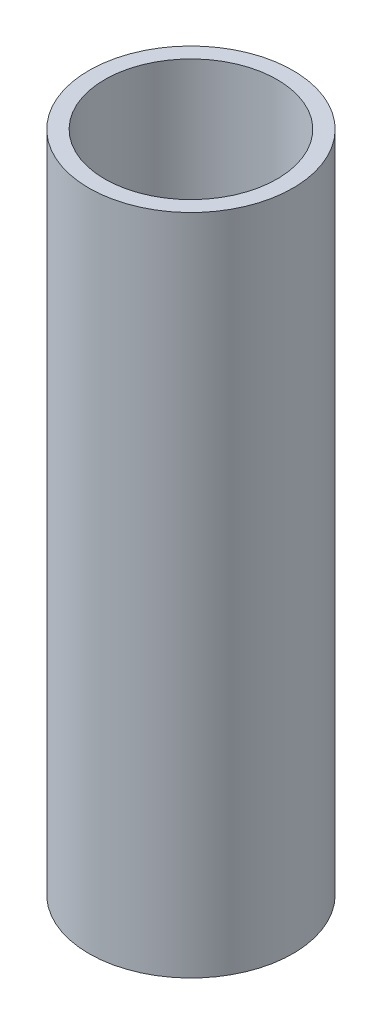
ISO-10303-21;
HEADER;
FILE_DESCRIPTION(('STEP AP214'),'2;1');
FILE_NAME('part.step','',(''),(''),'','','');
FILE_SCHEMA(('AUTOMOTIVE_DESIGN { 1 0 10303 214 1 1 1 1 }'));
ENDSEC;
DATA;
#1=APPLICATION_CONTEXT('core data for automotive mechanical design processes');
#2=APPLICATION_PROTOCOL_DEFINITION('international standard','automotive_design',2000,#1);
#3=PRODUCT_CONTEXT('',#1,'mechanical');
#4=PRODUCT('Part','Part','',(#3));
#5=PRODUCT_RELATED_PRODUCT_CATEGORY('part','',(#4));
#6=PRODUCT_DEFINITION_FORMATION('','',#4);
#7=PRODUCT_DEFINITION_CONTEXT('part definition',#1,'design');
#8=PRODUCT_DEFINITION('design','',#6,#7);
#9=PRODUCT_DEFINITION_SHAPE('','',#8);
#10=(LENGTH_UNIT() NAMED_UNIT(*) SI_UNIT(.MILLI.,.METRE.));
#11=(NAMED_UNIT(*) PLANE_ANGLE_UNIT() SI_UNIT($,.RADIAN.));
#12=(NAMED_UNIT(*) SI_UNIT($,.STERADIAN.) SOLID_ANGLE_UNIT());
#13=UNCERTAINTY_MEASURE_WITH_UNIT(LENGTH_MEASURE(1.E-05),#10,'distance_accuracy_value','');
#14=(GEOMETRIC_REPRESENTATION_CONTEXT(3) GLOBAL_UNCERTAINTY_ASSIGNED_CONTEXT((#13)) GLOBAL_UNIT_ASSIGNED_CONTEXT((#10,
#11,#12)) REPRESENTATION_CONTEXT('',''));
#15=CARTESIAN_POINT('',(0.,0.,0.));
#16=DIRECTION('',(0.,0.,1.));
#17=DIRECTION('',(1.,0.,0.));
#18=AXIS2_PLACEMENT_3D('',#15,#16,#17);
#19=CARTESIAN_POINT('',(0.,65.,0.));
#20=DIRECTION('',(0.,1.,0.));
#21=DIRECTION('',(0.,0.,1.));
#22=AXIS2_PLACEMENT_3D('',#19,#20,#21);
#23=PLANE('',#22);
#24=CARTESIAN_POINT('',(0.,65.,0.));
#25=DIRECTION('',(0.,1.,0.));
#26=DIRECTION('',(0.,0.,1.));
#27=AXIS2_PLACEMENT_3D('',#24,#25,#26);
#28=CIRCLE('',#27,10.);
#29=CARTESIAN_POINT('',(0.,65.,10.));
#30=VERTEX_POINT('',#29);
#31=EDGE_CURVE('E10',#30,#30,#28,.T.);
#32=ORIENTED_EDGE('',*,*,#31,.T.);
#33=EDGE_LOOP('',(#32));
#34=FACE_BOUND('',#33,.T.);
#35=CARTESIAN_POINT('',(0.,65.,0.));
#36=DIRECTION('',(0.,1.,0.));
#37=DIRECTION('',(0.,0.,1.));
#38=AXIS2_PLACEMENT_3D('',#35,#36,#37);
#39=CIRCLE('',#38,8.45);
#40=CARTESIAN_POINT('',(0.,65.,8.45));
#41=VERTEX_POINT('',#40);
#42=EDGE_CURVE('E50',#41,#41,#39,.T.);
#43=ORIENTED_EDGE('',*,*,#42,.F.);
#44=EDGE_LOOP('',(#43));
#45=FACE_BOUND('',#44,.T.);
#46=ADVANCED_FACE('F37',(#34,#45),#23,.T.);
#47=CARTESIAN_POINT('',(0.,0.,0.));
#48=DIRECTION('',(0.,1.,0.));
#49=DIRECTION('',(0.,0.,1.));
#50=AXIS2_PLACEMENT_3D('',#47,#48,#49);
#51=PLANE('',#50);
#52=CARTESIAN_POINT('',(0.,0.,0.));
#53=DIRECTION('',(0.,1.,0.));
#54=DIRECTION('',(0.,0.,1.));
#55=AXIS2_PLACEMENT_3D('',#52,#53,#54);
#56=CIRCLE('',#55,10.);
#57=CARTESIAN_POINT('',(0.,0.,10.));
#58=VERTEX_POINT('',#57);
#59=EDGE_CURVE('E41',#58,#58,#56,.T.);
#60=ORIENTED_EDGE('',*,*,#59,.F.);
#61=EDGE_LOOP('',(#60));
#62=FACE_BOUND('',#61,.T.);
#63=CARTESIAN_POINT('',(0.,0.,0.));
#64=DIRECTION('',(0.,1.,0.));
#65=DIRECTION('',(0.,0.,1.));
#66=AXIS2_PLACEMENT_3D('',#63,#64,#65);
#67=CIRCLE('',#66,8.45);
#68=CARTESIAN_POINT('',(0.,0.,8.45));
#69=VERTEX_POINT('',#68);
#70=EDGE_CURVE('E52',#69,#69,#67,.T.);
#71=ORIENTED_EDGE('',*,*,#70,.T.);
#72=EDGE_LOOP('',(#71));
#73=FACE_BOUND('',#72,.T.);
#74=ADVANCED_FACE('F64',(#62,#73),#51,.F.);
#75=CARTESIAN_POINT('',(0.,65.,0.));
#76=DIRECTION('',(0.,-1.,0.));
#77=DIRECTION('',(0.,0.,-1.));
#78=AXIS2_PLACEMENT_3D('',#75,#76,#77);
#79=CYLINDRICAL_SURFACE('',#78,10.);
#80=ORIENTED_EDGE('',*,*,#31,.F.);
#81=EDGE_LOOP('',(#80));
#82=FACE_BOUND('',#81,.T.);
#83=ORIENTED_EDGE('',*,*,#59,.T.);
#84=EDGE_LOOP('',(#83));
#85=FACE_BOUND('',#84,.T.);
#86=ADVANCED_FACE('F39',(#82,#85),#79,.T.);
#87=CARTESIAN_POINT('',(0.,65.,0.));
#88=DIRECTION('',(0.,-1.,0.));
#89=DIRECTION('',(0.,0.,-1.));
#90=AXIS2_PLACEMENT_3D('',#87,#88,#89);
#91=CYLINDRICAL_SURFACE('',#90,8.45);
#92=ORIENTED_EDGE('',*,*,#42,.T.);
#93=EDGE_LOOP('',(#92));
#94=FACE_BOUND('',#93,.T.);
#95=ORIENTED_EDGE('',*,*,#70,.F.);
#96=EDGE_LOOP('',(#95));
#97=FACE_BOUND('',#96,.T.);
#98=ADVANCED_FACE('F60',(#94,#97),#91,.F.);
#99=CLOSED_SHELL('',(#46,#74,#86,#98));
#100=MANIFOLD_SOLID_BREP('B2',#99);
#101=ADVANCED_BREP_SHAPE_REPRESENTATION('',(#18,#100),#14);
#102=SHAPE_DEFINITION_REPRESENTATION(#9,#101);
ENDSEC;
END-ISO-10303-21;
